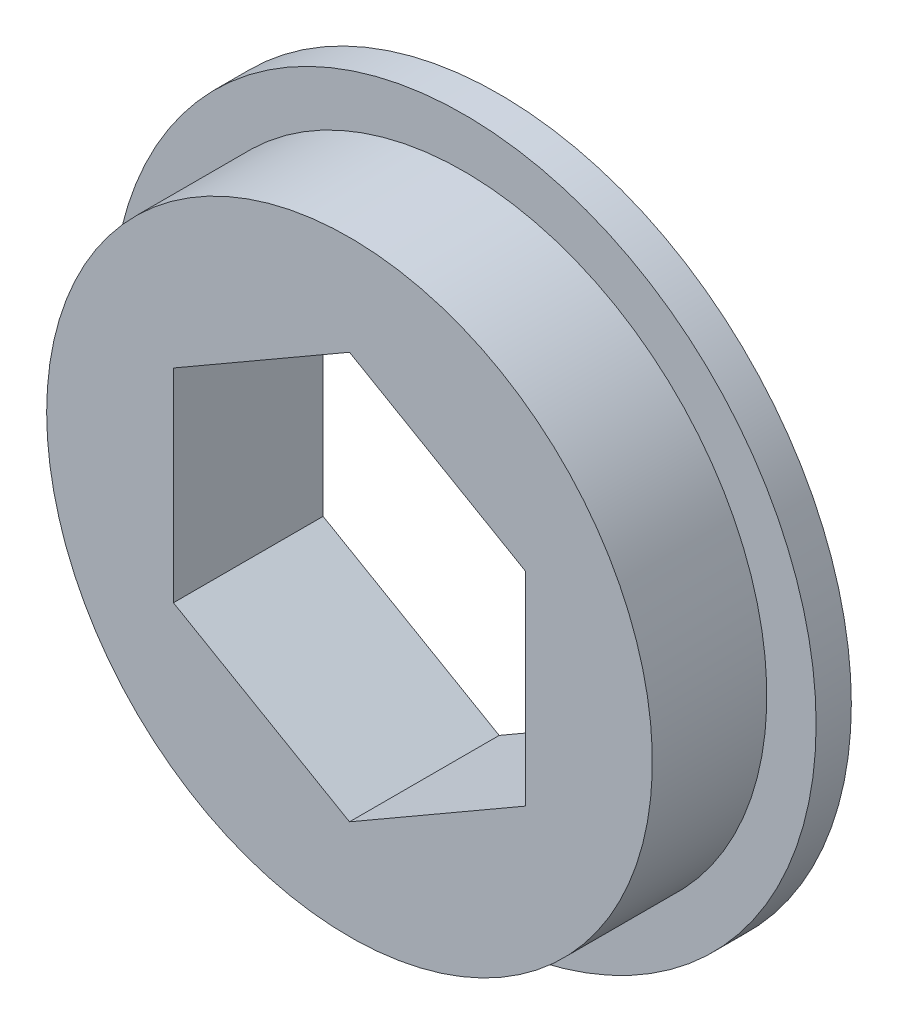
ISO-10303-21;
HEADER;
FILE_DESCRIPTION(('STEP AP214'),'2;1');
FILE_NAME('part.step','',(''),(''),'','','');
FILE_SCHEMA(('AUTOMOTIVE_DESIGN { 1 0 10303 214 1 1 1 1 }'));
ENDSEC;
DATA;
#1=APPLICATION_CONTEXT('core data for automotive mechanical design processes');
#2=APPLICATION_PROTOCOL_DEFINITION('international standard','automotive_design',2000,#1);
#3=PRODUCT_CONTEXT('',#1,'mechanical');
#4=PRODUCT('Part','Part','',(#3));
#5=PRODUCT_RELATED_PRODUCT_CATEGORY('part','',(#4));
#6=PRODUCT_DEFINITION_FORMATION('','',#4);
#7=PRODUCT_DEFINITION_CONTEXT('part definition',#1,'design');
#8=PRODUCT_DEFINITION('design','',#6,#7);
#9=PRODUCT_DEFINITION_SHAPE('','',#8);
#10=(LENGTH_UNIT() NAMED_UNIT(*) SI_UNIT(.MILLI.,.METRE.));
#11=(NAMED_UNIT(*) PLANE_ANGLE_UNIT() SI_UNIT($,.RADIAN.));
#12=(NAMED_UNIT(*) SI_UNIT($,.STERADIAN.) SOLID_ANGLE_UNIT());
#13=UNCERTAINTY_MEASURE_WITH_UNIT(LENGTH_MEASURE(1.E-05),#10,'distance_accuracy_value','');
#14=(GEOMETRIC_REPRESENTATION_CONTEXT(3) GLOBAL_UNCERTAINTY_ASSIGNED_CONTEXT((#13)) GLOBAL_UNIT_ASSIGNED_CONTEXT((#10,
#11,#12)) REPRESENTATION_CONTEXT('',''));
#15=CARTESIAN_POINT('',(0.,0.,0.));
#16=DIRECTION('',(0.,0.,1.));
#17=DIRECTION('',(1.,0.,0.));
#18=AXIS2_PLACEMENT_3D('',#15,#16,#17);
#19=CARTESIAN_POINT('',(0.,0.,2.));
#20=DIRECTION('',(0.,0.,-1.));
#21=DIRECTION('',(-1.,0.,0.));
#22=AXIS2_PLACEMENT_3D('',#19,#20,#21);
#23=CYLINDRICAL_SURFACE('',#22,20.);
#24=CARTESIAN_POINT('',(0.,0.,2.));
#25=DIRECTION('',(0.,0.,1.));
#26=DIRECTION('',(1.,0.,0.));
#27=AXIS2_PLACEMENT_3D('',#24,#25,#26);
#28=CIRCLE('',#27,20.);
#29=CARTESIAN_POINT('',(20.,0.,2.));
#30=VERTEX_POINT('',#29);
#31=EDGE_CURVE('E48',#30,#30,#28,.T.);
#32=ORIENTED_EDGE('',*,*,#31,.F.);
#33=EDGE_LOOP('',(#32));
#34=FACE_BOUND('',#33,.T.);
#35=CARTESIAN_POINT('',(0.,0.,0.));
#36=DIRECTION('',(0.,0.,1.));
#37=DIRECTION('',(1.,0.,0.));
#38=AXIS2_PLACEMENT_3D('',#35,#36,#37);
#39=CIRCLE('',#38,20.);
#40=CARTESIAN_POINT('',(20.,0.,0.));
#41=VERTEX_POINT('',#40);
#42=EDGE_CURVE('E42',#41,#41,#39,.T.);
#43=ORIENTED_EDGE('',*,*,#42,.T.);
#44=EDGE_LOOP('',(#43));
#45=FACE_BOUND('',#44,.T.);
#46=ADVANCED_FACE('F39',(#34,#45),#23,.T.);
#47=CARTESIAN_POINT('',(0.,0.,2.));
#48=DIRECTION('',(0.,0.,1.));
#49=DIRECTION('',(1.,0.,0.));
#50=AXIS2_PLACEMENT_3D('',#47,#48,#49);
#51=PLANE('',#50);
#52=CARTESIAN_POINT('',(0.,0.,2.));
#53=DIRECTION('',(0.,0.,1.));
#54=DIRECTION('',(1.,0.,0.));
#55=AXIS2_PLACEMENT_3D('',#52,#53,#54);
#56=CIRCLE('',#55,17.2);
#57=CARTESIAN_POINT('',(-17.2,0.,2.));
#58=VERTEX_POINT('',#57);
#59=EDGE_CURVE('E11',#58,#58,#56,.T.);
#60=ORIENTED_EDGE('',*,*,#59,.F.);
#61=EDGE_LOOP('',(#60));
#62=FACE_BOUND('',#61,.T.);
#63=ORIENTED_EDGE('',*,*,#31,.T.);
#64=EDGE_LOOP('',(#63));
#65=FACE_BOUND('',#64,.T.);
#66=ADVANCED_FACE('F177',(#62,#65),#51,.T.);
#67=CARTESIAN_POINT('',(0.,0.,0.));
#68=DIRECTION('',(0.,0.,1.));
#69=DIRECTION('',(1.,0.,0.));
#70=AXIS2_PLACEMENT_3D('',#67,#68,#69);
#71=PLANE('',#70);
#72=DIRECTION('',(0.,1.,0.));
#73=VECTOR('',#72,1.);
#74=CARTESIAN_POINT('',(10.,-5.77350269189626,0.));
#75=LINE('',#74,#73);
#76=CARTESIAN_POINT('',(10.,-5.77350269189626,0.));
#77=VERTEX_POINT('',#76);
#78=CARTESIAN_POINT('',(10.,5.77350269189626,0.));
#79=VERTEX_POINT('',#78);
#80=EDGE_CURVE('E103',#77,#79,#75,.T.);
#81=ORIENTED_EDGE('',*,*,#80,.T.);
#82=DIRECTION('',(-0.866025403784439,0.5,0.));
#83=VECTOR('',#82,1.);
#84=CARTESIAN_POINT('',(10.,5.77350269189626,0.));
#85=LINE('',#84,#83);
#86=CARTESIAN_POINT('',(0.,11.5470053837925,0.));
#87=VERTEX_POINT('',#86);
#88=EDGE_CURVE('E96',#79,#87,#85,.T.);
#89=ORIENTED_EDGE('',*,*,#88,.T.);
#90=DIRECTION('',(-0.866025403784439,-0.5,0.));
#91=VECTOR('',#90,1.);
#92=CARTESIAN_POINT('',(0.,11.5470053837925,0.));
#93=LINE('',#92,#91);
#94=CARTESIAN_POINT('',(-10.,5.77350269189626,0.));
#95=VERTEX_POINT('',#94);
#96=EDGE_CURVE('E106',#87,#95,#93,.T.);
#97=ORIENTED_EDGE('',*,*,#96,.T.);
#98=DIRECTION('',(0.,-1.,0.));
#99=VECTOR('',#98,1.);
#100=CARTESIAN_POINT('',(-10.,5.77350269189626,0.));
#101=LINE('',#100,#99);
#102=CARTESIAN_POINT('',(-10.,-5.77350269189626,0.));
#103=VERTEX_POINT('',#102);
#104=EDGE_CURVE('E56',#95,#103,#101,.T.);
#105=ORIENTED_EDGE('',*,*,#104,.T.);
#106=DIRECTION('',(0.866025403784439,-0.5,0.));
#107=VECTOR('',#106,1.);
#108=CARTESIAN_POINT('',(-10.,-5.77350269189626,0.));
#109=LINE('',#108,#107);
#110=CARTESIAN_POINT('',(0.,-11.5470053837925,0.));
#111=VERTEX_POINT('',#110);
#112=EDGE_CURVE('E125',#103,#111,#109,.T.);
#113=ORIENTED_EDGE('',*,*,#112,.T.);
#114=DIRECTION('',(0.866025403784439,0.5,0.));
#115=VECTOR('',#114,1.);
#116=CARTESIAN_POINT('',(0.,-11.5470053837925,0.));
#117=LINE('',#116,#115);
#118=EDGE_CURVE('E129',#111,#77,#117,.T.);
#119=ORIENTED_EDGE('',*,*,#118,.T.);
#120=EDGE_LOOP('',(#81,#89,#97,#105,#113,#119));
#121=FACE_BOUND('',#120,.T.);
#122=ORIENTED_EDGE('',*,*,#42,.F.);
#123=EDGE_LOOP('',(#122));
#124=FACE_BOUND('',#123,.T.);
#125=ADVANCED_FACE('F111',(#121,#124),#71,.F.);
#126=CARTESIAN_POINT('',(0.,0.,8.5));
#127=DIRECTION('',(0.,0.,-1.));
#128=DIRECTION('',(-1.,0.,0.));
#129=AXIS2_PLACEMENT_3D('',#126,#127,#128);
#130=CYLINDRICAL_SURFACE('',#129,17.2);
#131=CARTESIAN_POINT('',(0.,0.,8.5));
#132=DIRECTION('',(0.,0.,1.));
#133=DIRECTION('',(1.,0.,0.));
#134=AXIS2_PLACEMENT_3D('',#131,#132,#133);
#135=CIRCLE('',#134,17.2);
#136=CARTESIAN_POINT('',(-17.2,0.,8.5));
#137=VERTEX_POINT('',#136);
#138=EDGE_CURVE('E153',#137,#137,#135,.T.);
#139=CARTESIAN_POINT('',(-17.2,0.,8.5));
#140=CARTESIAN_POINT('',(-17.2,0.,8.43229166666667));
#141=CARTESIAN_POINT('',(-17.2,0.,8.36458333333333));
#142=CARTESIAN_POINT('',(-17.2,0.,8.22916666666667));
#143=CARTESIAN_POINT('',(-17.2,0.,8.16145833333333));
#144=CARTESIAN_POINT('',(-17.2,0.,8.02604166666667));
#145=CARTESIAN_POINT('',(-17.2,0.,7.95833333333333));
#146=CARTESIAN_POINT('',(-17.2,0.,7.82291666666667));
#147=CARTESIAN_POINT('',(-17.2,0.,7.75520833333333));
#148=CARTESIAN_POINT('',(-17.2,0.,7.61979166666667));
#149=CARTESIAN_POINT('',(-17.2,0.,7.55208333333333));
#150=CARTESIAN_POINT('',(-17.2,0.,7.41666666666667));
#151=CARTESIAN_POINT('',(-17.2,0.,7.34895833333333));
#152=CARTESIAN_POINT('',(-17.2,0.,7.21354166666667));
#153=CARTESIAN_POINT('',(-17.2,0.,7.14583333333333));
#154=CARTESIAN_POINT('',(-17.2,0.,7.01041666666667));
#155=CARTESIAN_POINT('',(-17.2,0.,6.94270833333333));
#156=CARTESIAN_POINT('',(-17.2,0.,6.80729166666667));
#157=CARTESIAN_POINT('',(-17.2,0.,6.73958333333333));
#158=CARTESIAN_POINT('',(-17.2,0.,6.60416666666667));
#159=CARTESIAN_POINT('',(-17.2,0.,6.53645833333333));
#160=CARTESIAN_POINT('',(-17.2,0.,6.40104166666667));
#161=CARTESIAN_POINT('',(-17.2,0.,6.33333333333333));
#162=CARTESIAN_POINT('',(-17.2,0.,6.19791666666667));
#163=CARTESIAN_POINT('',(-17.2,0.,6.13020833333333));
#164=CARTESIAN_POINT('',(-17.2,0.,5.99479166666667));
#165=CARTESIAN_POINT('',(-17.2,0.,5.92708333333333));
#166=CARTESIAN_POINT('',(-17.2,0.,5.79166666666667));
#167=CARTESIAN_POINT('',(-17.2,0.,5.72395833333333));
#168=CARTESIAN_POINT('',(-17.2,0.,5.58854166666667));
#169=CARTESIAN_POINT('',(-17.2,0.,5.52083333333333));
#170=CARTESIAN_POINT('',(-17.2,0.,5.38541666666667));
#171=CARTESIAN_POINT('',(-17.2,0.,5.31770833333333));
#172=CARTESIAN_POINT('',(-17.2,0.,5.18229166666667));
#173=CARTESIAN_POINT('',(-17.2,0.,5.11458333333333));
#174=CARTESIAN_POINT('',(-17.2,0.,4.97916666666667));
#175=CARTESIAN_POINT('',(-17.2,0.,4.91145833333333));
#176=CARTESIAN_POINT('',(-17.2,0.,4.77604166666667));
#177=CARTESIAN_POINT('',(-17.2,0.,4.70833333333333));
#178=CARTESIAN_POINT('',(-17.2,0.,4.57291666666667));
#179=CARTESIAN_POINT('',(-17.2,0.,4.50520833333333));
#180=CARTESIAN_POINT('',(-17.2,0.,4.36979166666667));
#181=CARTESIAN_POINT('',(-17.2,0.,4.30208333333333));
#182=CARTESIAN_POINT('',(-17.2,0.,4.16666666666667));
#183=CARTESIAN_POINT('',(-17.2,0.,4.09895833333333));
#184=CARTESIAN_POINT('',(-17.2,0.,3.96354166666667));
#185=CARTESIAN_POINT('',(-17.2,0.,3.89583333333333));
#186=CARTESIAN_POINT('',(-17.2,0.,3.76041666666667));
#187=CARTESIAN_POINT('',(-17.2,0.,3.69270833333333));
#188=CARTESIAN_POINT('',(-17.2,0.,3.55729166666667));
#189=CARTESIAN_POINT('',(-17.2,0.,3.48958333333333));
#190=CARTESIAN_POINT('',(-17.2,0.,3.35416666666667));
#191=CARTESIAN_POINT('',(-17.2,0.,3.28645833333333));
#192=CARTESIAN_POINT('',(-17.2,0.,3.15104166666667));
#193=CARTESIAN_POINT('',(-17.2,0.,3.08333333333333));
#194=CARTESIAN_POINT('',(-17.2,0.,2.94791666666667));
#195=CARTESIAN_POINT('',(-17.2,0.,2.88020833333333));
#196=CARTESIAN_POINT('',(-17.2,0.,2.74479166666667));
#197=CARTESIAN_POINT('',(-17.2,0.,2.67708333333333));
#198=CARTESIAN_POINT('',(-17.2,0.,2.54166666666667));
#199=CARTESIAN_POINT('',(-17.2,0.,2.47395833333333));
#200=CARTESIAN_POINT('',(-17.2,0.,2.33854166666667));
#201=CARTESIAN_POINT('',(-17.2,0.,2.27083333333333));
#202=CARTESIAN_POINT('',(-17.2,0.,2.13541666666667));
#203=CARTESIAN_POINT('',(-17.2,0.,2.06770833333333));
#204=CARTESIAN_POINT('',(-17.2,0.,2.));
#205=B_SPLINE_CURVE_WITH_KNOTS('',3,(#139,#140,#141,#142,#143,#144,#145,#146,#147,#148,#149,
#150,#151,#152,#153,#154,#155,#156,#157,#158,#159,#160,#161,#162,#163,#164,#165,#166,#167,#168,
#169,#170,#171,#172,#173,#174,#175,#176,#177,#178,#179,#180,#181,#182,#183,#184,#185,#186,#187,
#188,#189,#190,#191,#192,#193,#194,#195,#196,#197,#198,#199,#200,#201,#202,#203,#204),
.UNSPECIFIED.,.F.,.F.,(4,2,2,2,2,2,2,2,2,2,2,2,2,2,2,2,2,2,2,2,2,2,2,2,2,2,2,2,2,2,2,2,4),(0.,
0.203125,0.40625,0.609375000000001,0.812500000000001,1.015625,1.21875,1.421875,1.625,1.828125,
2.03125,2.234375,2.4375,2.640625,2.84375,3.046875,3.25,3.453125,3.65625,3.859375,4.0625,
4.265625,4.46875,4.671875,4.875,5.078125,5.28125,5.484375,5.6875,5.890625,6.09375,6.296875,6.5),.UNSPECIFIED.);
#206=EDGE_CURVE('BSEAM176',#137,#58,#205,.T.);
#207=ORIENTED_EDGE('',*,*,#138,.F.);
#208=ORIENTED_EDGE('',*,*,#59,.T.);
#209=ORIENTED_EDGE('',*,*,#206,.T.);
#210=ORIENTED_EDGE('',*,*,#206,.F.);
#211=EDGE_LOOP('',(#207,#209,#208,#210));
#212=FACE_BOUND('',#211,.T.);
#213=ADVANCED_FACE('F176',(#212),#130,.T.);
#214=CARTESIAN_POINT('',(0.,0.,8.5));
#215=DIRECTION('',(0.,0.,1.));
#216=DIRECTION('',(1.,0.,0.));
#217=AXIS2_PLACEMENT_3D('',#214,#215,#216);
#218=PLANE('',#217);
#219=DIRECTION('',(-0.866025403784439,0.5,0.));
#220=VECTOR('',#219,1.);
#221=CARTESIAN_POINT('',(10.,5.77350269189626,8.5));
#222=LINE('',#221,#220);
#223=CARTESIAN_POINT('',(10.,5.77350269189626,8.5));
#224=VERTEX_POINT('',#223);
#225=CARTESIAN_POINT('',(0.,11.5470053837925,8.5));
#226=VERTEX_POINT('',#225);
#227=EDGE_CURVE('E64',#224,#226,#222,.T.);
#228=ORIENTED_EDGE('',*,*,#227,.F.);
#229=DIRECTION('',(0.,1.,0.));
#230=VECTOR('',#229,1.);
#231=CARTESIAN_POINT('',(10.,-5.77350269189626,8.5));
#232=LINE('',#231,#230);
#233=CARTESIAN_POINT('',(10.,-5.77350269189626,8.5));
#234=VERTEX_POINT('',#233);
#235=EDGE_CURVE('E116',#234,#224,#232,.T.);
#236=ORIENTED_EDGE('',*,*,#235,.F.);
#237=DIRECTION('',(0.866025403784439,0.5,0.));
#238=VECTOR('',#237,1.);
#239=CARTESIAN_POINT('',(0.,-11.5470053837925,8.5));
#240=LINE('',#239,#238);
#241=CARTESIAN_POINT('',(0.,-11.5470053837925,8.5));
#242=VERTEX_POINT('',#241);
#243=EDGE_CURVE('E120',#242,#234,#240,.T.);
#244=ORIENTED_EDGE('',*,*,#243,.F.);
#245=DIRECTION('',(0.866025403784439,-0.5,0.));
#246=VECTOR('',#245,1.);
#247=CARTESIAN_POINT('',(-10.,-5.77350269189626,8.5));
#248=LINE('',#247,#246);
#249=CARTESIAN_POINT('',(-10.,-5.77350269189626,8.5));
#250=VERTEX_POINT('',#249);
#251=EDGE_CURVE('E143',#250,#242,#248,.T.);
#252=ORIENTED_EDGE('',*,*,#251,.F.);
#253=DIRECTION('',(0.,-1.,0.));
#254=VECTOR('',#253,1.);
#255=CARTESIAN_POINT('',(-10.,5.77350269189626,8.5));
#256=LINE('',#255,#254);
#257=CARTESIAN_POINT('',(-10.,5.77350269189626,8.5));
#258=VERTEX_POINT('',#257);
#259=EDGE_CURVE('E139',#258,#250,#256,.T.);
#260=ORIENTED_EDGE('',*,*,#259,.F.);
#261=DIRECTION('',(-0.866025403784439,-0.5,0.));
#262=VECTOR('',#261,1.);
#263=CARTESIAN_POINT('',(0.,11.5470053837925,8.5));
#264=LINE('',#263,#262);
#265=EDGE_CURVE('E136',#226,#258,#264,.T.);
#266=ORIENTED_EDGE('',*,*,#265,.F.);
#267=EDGE_LOOP('',(#228,#236,#244,#252,#260,#266));
#268=FACE_BOUND('',#267,.T.);
#269=ORIENTED_EDGE('',*,*,#138,.T.);
#270=EDGE_LOOP('',(#269));
#271=FACE_BOUND('',#270,.T.);
#272=ADVANCED_FACE('F182',(#268,#271),#218,.T.);
#273=CARTESIAN_POINT('',(10.,5.77350269189626,0.));
#274=DIRECTION('',(0.5,0.866025403784439,0.));
#275=DIRECTION('',(-0.866025403784439,0.5,0.));
#276=AXIS2_PLACEMENT_3D('',#273,#274,#275);
#277=PLANE('',#276);
#278=ORIENTED_EDGE('',*,*,#227,.T.);
#279=DIRECTION('',(0.,0.,1.));
#280=VECTOR('',#279,1.);
#281=CARTESIAN_POINT('',(0.,11.5470053837925,0.));
#282=LINE('',#281,#280);
#283=EDGE_CURVE('E92',#87,#226,#282,.T.);
#284=ORIENTED_EDGE('',*,*,#283,.F.);
#285=ORIENTED_EDGE('',*,*,#88,.F.);
#286=DIRECTION('',(0.,0.,1.));
#287=VECTOR('',#286,1.);
#288=CARTESIAN_POINT('',(10.,5.77350269189626,0.));
#289=LINE('',#288,#287);
#290=EDGE_CURVE('E150',#79,#224,#289,.T.);
#291=ORIENTED_EDGE('',*,*,#290,.T.);
#292=EDGE_LOOP('',(#278,#284,#285,#291));
#293=FACE_BOUND('',#292,.T.);
#294=ADVANCED_FACE('F94',(#293),#277,.F.);
#295=CARTESIAN_POINT('',(10.,-5.77350269189626,0.));
#296=DIRECTION('',(1.,0.,0.));
#297=DIRECTION('',(0.,1.,0.));
#298=AXIS2_PLACEMENT_3D('',#295,#296,#297);
#299=PLANE('',#298);
#300=ORIENTED_EDGE('',*,*,#235,.T.);
#301=ORIENTED_EDGE('',*,*,#290,.F.);
#302=ORIENTED_EDGE('',*,*,#80,.F.);
#303=DIRECTION('',(0.,0.,1.));
#304=VECTOR('',#303,1.);
#305=CARTESIAN_POINT('',(10.,-5.77350269189626,0.));
#306=LINE('',#305,#304);
#307=EDGE_CURVE('E154',#77,#234,#306,.T.);
#308=ORIENTED_EDGE('',*,*,#307,.T.);
#309=EDGE_LOOP('',(#300,#301,#302,#308));
#310=FACE_BOUND('',#309,.T.);
#311=ADVANCED_FACE('F223',(#310),#299,.F.);
#312=CARTESIAN_POINT('',(0.,-11.5470053837925,0.));
#313=DIRECTION('',(0.5,-0.866025403784439,0.));
#314=DIRECTION('',(0.866025403784439,0.5,0.));
#315=AXIS2_PLACEMENT_3D('',#312,#313,#314);
#316=PLANE('',#315);
#317=ORIENTED_EDGE('',*,*,#243,.T.);
#318=ORIENTED_EDGE('',*,*,#307,.F.);
#319=ORIENTED_EDGE('',*,*,#118,.F.);
#320=DIRECTION('',(0.,0.,1.));
#321=VECTOR('',#320,1.);
#322=CARTESIAN_POINT('',(0.,-11.5470053837925,0.));
#323=LINE('',#322,#321);
#324=EDGE_CURVE('E157',#111,#242,#323,.T.);
#325=ORIENTED_EDGE('',*,*,#324,.T.);
#326=EDGE_LOOP('',(#317,#318,#319,#325));
#327=FACE_BOUND('',#326,.T.);
#328=ADVANCED_FACE('F232',(#327),#316,.F.);
#329=CARTESIAN_POINT('',(-10.,-5.77350269189626,0.));
#330=DIRECTION('',(-0.5,-0.866025403784439,0.));
#331=DIRECTION('',(0.866025403784439,-0.5,0.));
#332=AXIS2_PLACEMENT_3D('',#329,#330,#331);
#333=PLANE('',#332);
#334=ORIENTED_EDGE('',*,*,#251,.T.);
#335=ORIENTED_EDGE('',*,*,#324,.F.);
#336=ORIENTED_EDGE('',*,*,#112,.F.);
#337=DIRECTION('',(0.,0.,1.));
#338=VECTOR('',#337,1.);
#339=CARTESIAN_POINT('',(-10.,-5.77350269189626,0.));
#340=LINE('',#339,#338);
#341=EDGE_CURVE('E160',#103,#250,#340,.T.);
#342=ORIENTED_EDGE('',*,*,#341,.T.);
#343=EDGE_LOOP('',(#334,#335,#336,#342));
#344=FACE_BOUND('',#343,.T.);
#345=ADVANCED_FACE('F242',(#344),#333,.F.);
#346=CARTESIAN_POINT('',(-10.,5.77350269189626,0.));
#347=DIRECTION('',(-1.,0.,0.));
#348=DIRECTION('',(0.,-1.,0.));
#349=AXIS2_PLACEMENT_3D('',#346,#347,#348);
#350=PLANE('',#349);
#351=ORIENTED_EDGE('',*,*,#259,.T.);
#352=ORIENTED_EDGE('',*,*,#341,.F.);
#353=ORIENTED_EDGE('',*,*,#104,.F.);
#354=DIRECTION('',(0.,0.,1.));
#355=VECTOR('',#354,1.);
#356=CARTESIAN_POINT('',(-10.,5.77350269189626,0.));
#357=LINE('',#356,#355);
#358=EDGE_CURVE('E102',#95,#258,#357,.T.);
#359=ORIENTED_EDGE('',*,*,#358,.T.);
#360=EDGE_LOOP('',(#351,#352,#353,#359));
#361=FACE_BOUND('',#360,.T.);
#362=ADVANCED_FACE('F252',(#361),#350,.F.);
#363=CARTESIAN_POINT('',(0.,11.5470053837925,0.));
#364=DIRECTION('',(-0.5,0.866025403784439,0.));
#365=DIRECTION('',(-0.866025403784439,-0.5,0.));
#366=AXIS2_PLACEMENT_3D('',#363,#364,#365);
#367=PLANE('',#366);
#368=ORIENTED_EDGE('',*,*,#265,.T.);
#369=ORIENTED_EDGE('',*,*,#358,.F.);
#370=ORIENTED_EDGE('',*,*,#96,.F.);
#371=ORIENTED_EDGE('',*,*,#283,.T.);
#372=EDGE_LOOP('',(#368,#369,#370,#371));
#373=FACE_BOUND('',#372,.T.);
#374=ADVANCED_FACE('F107',(#373),#367,.F.);
#375=CLOSED_SHELL('',(#46,#66,#125,#213,#272,#294,#311,#328,#345,#362,#374));
#376=MANIFOLD_SOLID_BREP('B2',#375);
#377=ADVANCED_BREP_SHAPE_REPRESENTATION('',(#18,#376),#14);
#378=SHAPE_DEFINITION_REPRESENTATION(#9,#377);
ENDSEC;
END-ISO-10303-21;
